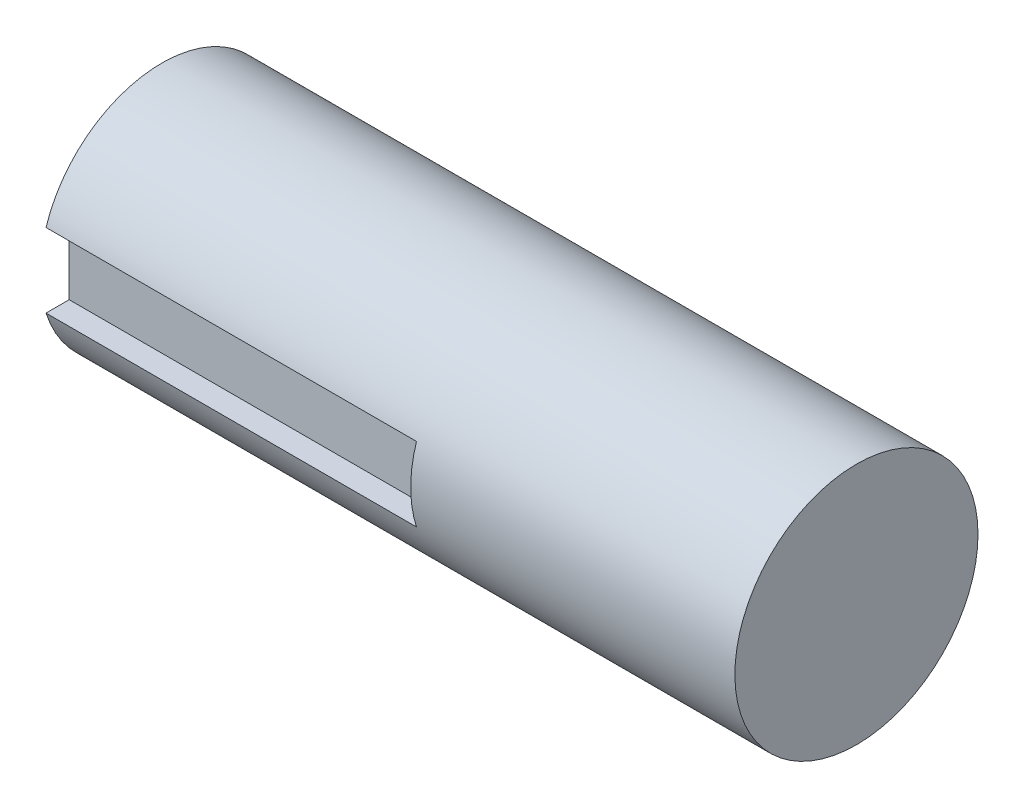
ISO-10303-21;
HEADER;
FILE_DESCRIPTION(('STEP AP214'),'2;1');
FILE_NAME('part.step','',(''),(''),'','','');
FILE_SCHEMA(('AUTOMOTIVE_DESIGN { 1 0 10303 214 1 1 1 1 }'));
ENDSEC;
DATA;
#1=APPLICATION_CONTEXT('core data for automotive mechanical design processes');
#2=APPLICATION_PROTOCOL_DEFINITION('international standard','automotive_design',2000,#1);
#3=PRODUCT_CONTEXT('',#1,'mechanical');
#4=PRODUCT('Part','Part','',(#3));
#5=PRODUCT_RELATED_PRODUCT_CATEGORY('part','',(#4));
#6=PRODUCT_DEFINITION_FORMATION('','',#4);
#7=PRODUCT_DEFINITION_CONTEXT('part definition',#1,'design');
#8=PRODUCT_DEFINITION('design','',#6,#7);
#9=PRODUCT_DEFINITION_SHAPE('','',#8);
#10=(LENGTH_UNIT() NAMED_UNIT(*) SI_UNIT(.MILLI.,.METRE.));
#11=(NAMED_UNIT(*) PLANE_ANGLE_UNIT() SI_UNIT($,.RADIAN.));
#12=(NAMED_UNIT(*) SI_UNIT($,.STERADIAN.) SOLID_ANGLE_UNIT());
#13=UNCERTAINTY_MEASURE_WITH_UNIT(LENGTH_MEASURE(1.E-05),#10,'distance_accuracy_value','');
#14=(GEOMETRIC_REPRESENTATION_CONTEXT(3) GLOBAL_UNCERTAINTY_ASSIGNED_CONTEXT((#13)) GLOBAL_UNIT_ASSIGNED_CONTEXT((#10,
#11,#12)) REPRESENTATION_CONTEXT('',''));
#15=CARTESIAN_POINT('',(0.,0.,0.));
#16=DIRECTION('',(0.,0.,1.));
#17=DIRECTION('',(1.,0.,0.));
#18=AXIS2_PLACEMENT_3D('',#15,#16,#17);
#19=CARTESIAN_POINT('',(300.,0.,0.));
#20=DIRECTION('',(-1.,0.,0.));
#21=DIRECTION('',(0.,0.,1.));
#22=AXIS2_PLACEMENT_3D('',#19,#20,#21);
#23=CYLINDRICAL_SURFACE('',#22,52.5);
#24=CARTESIAN_POINT('',(300.,0.,0.));
#25=DIRECTION('',(1.,0.,0.));
#26=DIRECTION('',(0.,0.,-1.));
#27=AXIS2_PLACEMENT_3D('',#24,#25,#26);
#28=CIRCLE('',#27,52.5);
#29=CARTESIAN_POINT('',(300.,0.,-52.5));
#30=VERTEX_POINT('',#29);
#31=EDGE_CURVE('E11',#30,#30,#28,.T.);
#32=ORIENTED_EDGE('',*,*,#31,.F.);
#33=EDGE_LOOP('',(#32));
#34=FACE_BOUND('',#33,.T.);
#35=CARTESIAN_POINT('',(160.,0.,0.));
#36=DIRECTION('',(-1.,0.,0.));
#37=DIRECTION('',(0.,0.,1.));
#38=AXIS2_PLACEMENT_3D('',#35,#36,#37);
#39=CIRCLE('',#38,52.5);
#40=CARTESIAN_POINT('',(160.,-16.,50.0024999375031));
#41=VERTEX_POINT('',#40);
#42=CARTESIAN_POINT('',(160.,16.,50.0024999375031));
#43=VERTEX_POINT('',#42);
#44=EDGE_CURVE('E109',#41,#43,#39,.T.);
#45=ORIENTED_EDGE('',*,*,#44,.F.);
#46=DIRECTION('',(-1.,0.,0.));
#47=VECTOR('',#46,1.);
#48=CARTESIAN_POINT('',(160.,-16.,50.0024999375031));
#49=LINE('',#48,#47);
#50=CARTESIAN_POINT('',(0.,-16.,50.0024999375031));
#51=VERTEX_POINT('',#50);
#52=EDGE_CURVE('E69',#41,#51,#49,.T.);
#53=ORIENTED_EDGE('',*,*,#52,.T.);
#54=CARTESIAN_POINT('',(0.,0.,0.));
#55=DIRECTION('',(1.,0.,0.));
#56=DIRECTION('',(0.,0.,-1.));
#57=AXIS2_PLACEMENT_3D('',#54,#55,#56);
#58=CIRCLE('',#57,52.5);
#59=CARTESIAN_POINT('',(0.,16.,50.0024999375031));
#60=VERTEX_POINT('',#59);
#61=EDGE_CURVE('E48',#51,#60,#58,.T.);
#62=ORIENTED_EDGE('',*,*,#61,.T.);
#63=DIRECTION('',(-1.,0.,0.));
#64=VECTOR('',#63,1.);
#65=CARTESIAN_POINT('',(160.,16.,50.0024999375031));
#66=LINE('',#65,#64);
#67=EDGE_CURVE('E60',#43,#60,#66,.T.);
#68=ORIENTED_EDGE('',*,*,#67,.F.);
#69=EDGE_LOOP('',(#45,#53,#62,#68));
#70=FACE_BOUND('',#69,.T.);
#71=ADVANCED_FACE('F45',(#34,#70),#23,.T.);
#72=CARTESIAN_POINT('',(300.,0.,0.));
#73=DIRECTION('',(1.,0.,0.));
#74=DIRECTION('',(0.,0.,-1.));
#75=AXIS2_PLACEMENT_3D('',#72,#73,#74);
#76=PLANE('',#75);
#77=ORIENTED_EDGE('',*,*,#31,.T.);
#78=EDGE_LOOP('',(#77));
#79=FACE_BOUND('',#78,.T.);
#80=ADVANCED_FACE('F137',(#79),#76,.T.);
#81=CARTESIAN_POINT('',(0.,0.,0.));
#82=DIRECTION('',(1.,0.,0.));
#83=DIRECTION('',(0.,0.,-1.));
#84=AXIS2_PLACEMENT_3D('',#81,#82,#83);
#85=PLANE('',#84);
#86=ORIENTED_EDGE('',*,*,#61,.F.);
#87=DIRECTION('',(0.,0.,1.));
#88=VECTOR('',#87,1.);
#89=CARTESIAN_POINT('',(0.,-16.,40.0024999375031));
#90=LINE('',#89,#88);
#91=CARTESIAN_POINT('',(0.,-16.,40.0024999375031));
#92=VERTEX_POINT('',#91);
#93=EDGE_CURVE('E84',#92,#51,#90,.T.);
#94=ORIENTED_EDGE('',*,*,#93,.F.);
#95=DIRECTION('',(0.,-1.,0.));
#96=VECTOR('',#95,1.);
#97=CARTESIAN_POINT('',(0.,16.,40.0024999375031));
#98=LINE('',#97,#96);
#99=CARTESIAN_POINT('',(0.,16.,40.0024999375031));
#100=VERTEX_POINT('',#99);
#101=EDGE_CURVE('E119',#100,#92,#98,.T.);
#102=ORIENTED_EDGE('',*,*,#101,.F.);
#103=DIRECTION('',(0.,0.,-1.));
#104=VECTOR('',#103,1.);
#105=CARTESIAN_POINT('',(0.,16.,40.0024999375031));
#106=LINE('',#105,#104);
#107=EDGE_CURVE('E93',#60,#100,#106,.T.);
#108=ORIENTED_EDGE('',*,*,#107,.F.);
#109=EDGE_LOOP('',(#86,#94,#102,#108));
#110=FACE_BOUND('',#109,.T.);
#111=ADVANCED_FACE('F134',(#110),#85,.F.);
#112=CARTESIAN_POINT('',(160.,-16.,40.0024999375031));
#113=DIRECTION('',(0.,-1.,0.));
#114=DIRECTION('',(0.,0.,-1.));
#115=AXIS2_PLACEMENT_3D('',#112,#113,#114);
#116=PLANE('',#115);
#117=ORIENTED_EDGE('',*,*,#93,.T.);
#118=ORIENTED_EDGE('',*,*,#52,.F.);
#119=DIRECTION('',(0.,0.,1.));
#120=VECTOR('',#119,1.);
#121=CARTESIAN_POINT('',(160.,-16.,40.0024999375031));
#122=LINE('',#121,#120);
#123=CARTESIAN_POINT('',(160.,-16.,40.0024999375031));
#124=VERTEX_POINT('',#123);
#125=EDGE_CURVE('E105',#124,#41,#122,.T.);
#126=ORIENTED_EDGE('',*,*,#125,.F.);
#127=DIRECTION('',(-1.,0.,0.));
#128=VECTOR('',#127,1.);
#129=CARTESIAN_POINT('',(160.,-16.,40.0024999375031));
#130=LINE('',#129,#128);
#131=EDGE_CURVE('E98',#124,#92,#130,.T.);
#132=ORIENTED_EDGE('',*,*,#131,.T.);
#133=EDGE_LOOP('',(#117,#118,#126,#132));
#134=FACE_BOUND('',#133,.T.);
#135=ADVANCED_FACE('F136',(#134),#116,.F.);
#136=CARTESIAN_POINT('',(160.,16.,40.0024999375031));
#137=DIRECTION('',(0.,0.,-1.));
#138=DIRECTION('',(-1.,0.,0.));
#139=AXIS2_PLACEMENT_3D('',#136,#137,#138);
#140=PLANE('',#139);
#141=ORIENTED_EDGE('',*,*,#101,.T.);
#142=ORIENTED_EDGE('',*,*,#131,.F.);
#143=DIRECTION('',(0.,-1.,0.));
#144=VECTOR('',#143,1.);
#145=CARTESIAN_POINT('',(160.,16.,40.0024999375031));
#146=LINE('',#145,#144);
#147=CARTESIAN_POINT('',(160.,16.,40.0024999375031));
#148=VERTEX_POINT('',#147);
#149=EDGE_CURVE('E101',#148,#124,#146,.T.);
#150=ORIENTED_EDGE('',*,*,#149,.F.);
#151=DIRECTION('',(-1.,0.,0.));
#152=VECTOR('',#151,1.);
#153=CARTESIAN_POINT('',(160.,16.,40.0024999375031));
#154=LINE('',#153,#152);
#155=EDGE_CURVE('E90',#148,#100,#154,.T.);
#156=ORIENTED_EDGE('',*,*,#155,.T.);
#157=EDGE_LOOP('',(#141,#142,#150,#156));
#158=FACE_BOUND('',#157,.T.);
#159=ADVANCED_FACE('F102',(#158),#140,.F.);
#160=CARTESIAN_POINT('',(160.,16.,40.0024999375031));
#161=DIRECTION('',(0.,1.,0.));
#162=DIRECTION('',(0.,0.,1.));
#163=AXIS2_PLACEMENT_3D('',#160,#161,#162);
#164=PLANE('',#163);
#165=ORIENTED_EDGE('',*,*,#107,.T.);
#166=ORIENTED_EDGE('',*,*,#155,.F.);
#167=DIRECTION('',(0.,0.,-1.));
#168=VECTOR('',#167,1.);
#169=CARTESIAN_POINT('',(160.,16.,40.0024999375031));
#170=LINE('',#169,#168);
#171=EDGE_CURVE('E88',#43,#148,#170,.T.);
#172=ORIENTED_EDGE('',*,*,#171,.F.);
#173=ORIENTED_EDGE('',*,*,#67,.T.);
#174=EDGE_LOOP('',(#165,#166,#172,#173));
#175=FACE_BOUND('',#174,.T.);
#176=ADVANCED_FACE('F92',(#175),#164,.F.);
#177=CARTESIAN_POINT('',(160.,0.,0.));
#178=DIRECTION('',(-1.,0.,0.));
#179=DIRECTION('',(0.,0.,1.));
#180=AXIS2_PLACEMENT_3D('',#177,#178,#179);
#181=PLANE('',#180);
#182=ORIENTED_EDGE('',*,*,#44,.T.);
#183=ORIENTED_EDGE('',*,*,#171,.T.);
#184=ORIENTED_EDGE('',*,*,#149,.T.);
#185=ORIENTED_EDGE('',*,*,#125,.T.);
#186=EDGE_LOOP('',(#182,#183,#184,#185));
#187=FACE_BOUND('',#186,.T.);
#188=ADVANCED_FACE('F107',(#187),#181,.T.);
#189=CLOSED_SHELL('',(#71,#80,#111,#135,#159,#176,#188));
#190=MANIFOLD_SOLID_BREP('B2',#189);
#191=ADVANCED_BREP_SHAPE_REPRESENTATION('',(#18,#190),#14);
#192=SHAPE_DEFINITION_REPRESENTATION(#9,#191);
ENDSEC;
END-ISO-10303-21;
